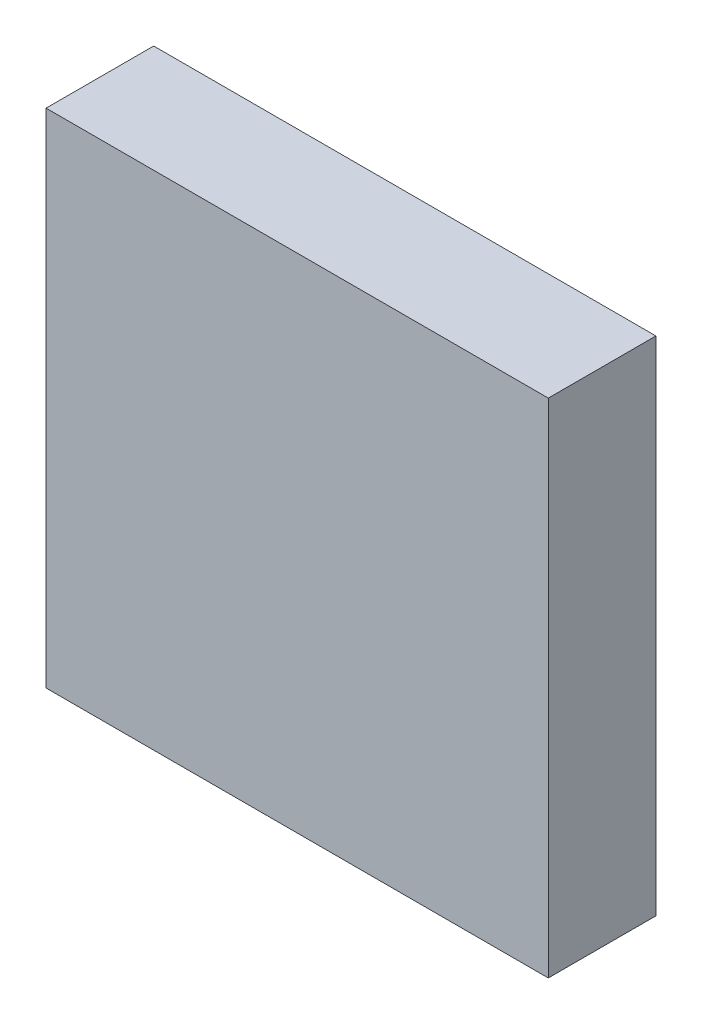
ISO-10303-21;
HEADER;
FILE_DESCRIPTION(('STEP AP214'),'2;1');
FILE_NAME('part.step','',(''),(''),'','','');
FILE_SCHEMA(('AUTOMOTIVE_DESIGN { 1 0 10303 214 1 1 1 1 }'));
ENDSEC;
DATA;
#1=APPLICATION_CONTEXT('core data for automotive mechanical design processes');
#2=APPLICATION_PROTOCOL_DEFINITION('international standard','automotive_design',2000,#1);
#3=PRODUCT_CONTEXT('',#1,'mechanical');
#4=PRODUCT('Part','Part','',(#3));
#5=PRODUCT_RELATED_PRODUCT_CATEGORY('part','',(#4));
#6=PRODUCT_DEFINITION_FORMATION('','',#4);
#7=PRODUCT_DEFINITION_CONTEXT('part definition',#1,'design');
#8=PRODUCT_DEFINITION('design','',#6,#7);
#9=PRODUCT_DEFINITION_SHAPE('','',#8);
#10=(LENGTH_UNIT() NAMED_UNIT(*) SI_UNIT(.MILLI.,.METRE.));
#11=(NAMED_UNIT(*) PLANE_ANGLE_UNIT() SI_UNIT($,.RADIAN.));
#12=(NAMED_UNIT(*) SI_UNIT($,.STERADIAN.) SOLID_ANGLE_UNIT());
#13=UNCERTAINTY_MEASURE_WITH_UNIT(LENGTH_MEASURE(1.E-05),#10,'distance_accuracy_value','');
#14=(GEOMETRIC_REPRESENTATION_CONTEXT(3) GLOBAL_UNCERTAINTY_ASSIGNED_CONTEXT((#13)) GLOBAL_UNIT_ASSIGNED_CONTEXT((#10,
#11,#12)) REPRESENTATION_CONTEXT('',''));
#15=CARTESIAN_POINT('',(0.,0.,0.));
#16=DIRECTION('',(0.,0.,1.));
#17=DIRECTION('',(1.,0.,0.));
#18=AXIS2_PLACEMENT_3D('',#15,#16,#17);
#19=CARTESIAN_POINT('',(7.,7.,3.));
#20=DIRECTION('',(-1.,0.,0.));
#21=DIRECTION('',(0.,-1.,0.));
#22=AXIS2_PLACEMENT_3D('',#19,#20,#21);
#23=PLANE('',#22);
#24=DIRECTION('',(0.,1.,0.));
#25=VECTOR('',#24,1.);
#26=CARTESIAN_POINT('',(7.,7.,0.));
#27=LINE('',#26,#25);
#28=CARTESIAN_POINT('',(7.,-7.,0.));
#29=VERTEX_POINT('',#28);
#30=CARTESIAN_POINT('',(7.,7.,0.));
#31=VERTEX_POINT('',#30);
#32=EDGE_CURVE('E96',#29,#31,#27,.T.);
#33=ORIENTED_EDGE('',*,*,#32,.T.);
#34=DIRECTION('',(0.,0.,-1.));
#35=VECTOR('',#34,1.);
#36=CARTESIAN_POINT('',(7.,7.,3.));
#37=LINE('',#36,#35);
#38=CARTESIAN_POINT('',(7.,7.,3.));
#39=VERTEX_POINT('',#38);
#40=EDGE_CURVE('E11',#39,#31,#37,.T.);
#41=ORIENTED_EDGE('',*,*,#40,.F.);
#42=DIRECTION('',(0.,1.,0.));
#43=VECTOR('',#42,1.);
#44=CARTESIAN_POINT('',(7.,7.,3.));
#45=LINE('',#44,#43);
#46=CARTESIAN_POINT('',(7.,-7.,3.));
#47=VERTEX_POINT('',#46);
#48=EDGE_CURVE('E84',#47,#39,#45,.T.);
#49=ORIENTED_EDGE('',*,*,#48,.F.);
#50=DIRECTION('',(0.,0.,-1.));
#51=VECTOR('',#50,1.);
#52=CARTESIAN_POINT('',(7.,-7.,3.));
#53=LINE('',#52,#51);
#54=EDGE_CURVE('E92',#47,#29,#53,.T.);
#55=ORIENTED_EDGE('',*,*,#54,.T.);
#56=EDGE_LOOP('',(#33,#41,#49,#55));
#57=FACE_BOUND('',#56,.T.);
#58=ADVANCED_FACE('F33',(#57),#23,.F.);
#59=CARTESIAN_POINT('',(-7.,7.,3.));
#60=DIRECTION('',(0.,-1.,0.));
#61=DIRECTION('',(0.,0.,-1.));
#62=AXIS2_PLACEMENT_3D('',#59,#60,#61);
#63=PLANE('',#62);
#64=DIRECTION('',(-1.,0.,0.));
#65=VECTOR('',#64,1.);
#66=CARTESIAN_POINT('',(-7.,7.,0.));
#67=LINE('',#66,#65);
#68=CARTESIAN_POINT('',(-7.,7.,0.));
#69=VERTEX_POINT('',#68);
#70=EDGE_CURVE('E88',#31,#69,#67,.T.);
#71=ORIENTED_EDGE('',*,*,#70,.T.);
#72=DIRECTION('',(0.,0.,-1.));
#73=VECTOR('',#72,1.);
#74=CARTESIAN_POINT('',(-7.,7.,3.));
#75=LINE('',#74,#73);
#76=CARTESIAN_POINT('',(-7.,7.,3.));
#77=VERTEX_POINT('',#76);
#78=EDGE_CURVE('E41',#77,#69,#75,.T.);
#79=ORIENTED_EDGE('',*,*,#78,.F.);
#80=DIRECTION('',(-1.,0.,0.));
#81=VECTOR('',#80,1.);
#82=CARTESIAN_POINT('',(-7.,7.,3.));
#83=LINE('',#82,#81);
#84=EDGE_CURVE('E79',#39,#77,#83,.T.);
#85=ORIENTED_EDGE('',*,*,#84,.F.);
#86=ORIENTED_EDGE('',*,*,#40,.T.);
#87=EDGE_LOOP('',(#71,#79,#85,#86));
#88=FACE_BOUND('',#87,.T.);
#89=ADVANCED_FACE('F87',(#88),#63,.F.);
#90=CARTESIAN_POINT('',(-7.,7.,3.));
#91=DIRECTION('',(1.,0.,0.));
#92=DIRECTION('',(0.,1.,0.));
#93=AXIS2_PLACEMENT_3D('',#90,#91,#92);
#94=PLANE('',#93);
#95=DIRECTION('',(0.,-1.,0.));
#96=VECTOR('',#95,1.);
#97=CARTESIAN_POINT('',(-7.,7.,0.));
#98=LINE('',#97,#96);
#99=CARTESIAN_POINT('',(-7.,-7.,0.));
#100=VERTEX_POINT('',#99);
#101=EDGE_CURVE('E66',#69,#100,#98,.T.);
#102=ORIENTED_EDGE('',*,*,#101,.T.);
#103=DIRECTION('',(0.,0.,-1.));
#104=VECTOR('',#103,1.);
#105=CARTESIAN_POINT('',(-7.,-7.,3.));
#106=LINE('',#105,#104);
#107=CARTESIAN_POINT('',(-7.,-7.,3.));
#108=VERTEX_POINT('',#107);
#109=EDGE_CURVE('E89',#108,#100,#106,.T.);
#110=ORIENTED_EDGE('',*,*,#109,.F.);
#111=DIRECTION('',(0.,-1.,0.));
#112=VECTOR('',#111,1.);
#113=CARTESIAN_POINT('',(-7.,7.,3.));
#114=LINE('',#113,#112);
#115=EDGE_CURVE('E82',#77,#108,#114,.T.);
#116=ORIENTED_EDGE('',*,*,#115,.F.);
#117=ORIENTED_EDGE('',*,*,#78,.T.);
#118=EDGE_LOOP('',(#102,#110,#116,#117));
#119=FACE_BOUND('',#118,.T.);
#120=ADVANCED_FACE('F90',(#119),#94,.F.);
#121=CARTESIAN_POINT('',(-7.,-7.,3.));
#122=DIRECTION('',(0.,1.,0.));
#123=DIRECTION('',(0.,0.,1.));
#124=AXIS2_PLACEMENT_3D('',#121,#122,#123);
#125=PLANE('',#124);
#126=DIRECTION('',(1.,0.,0.));
#127=VECTOR('',#126,1.);
#128=CARTESIAN_POINT('',(-7.,-7.,0.));
#129=LINE('',#128,#127);
#130=EDGE_CURVE('E72',#100,#29,#129,.T.);
#131=ORIENTED_EDGE('',*,*,#130,.T.);
#132=ORIENTED_EDGE('',*,*,#54,.F.);
#133=DIRECTION('',(1.,0.,0.));
#134=VECTOR('',#133,1.);
#135=CARTESIAN_POINT('',(-7.,-7.,3.));
#136=LINE('',#135,#134);
#137=EDGE_CURVE('E49',#108,#47,#136,.T.);
#138=ORIENTED_EDGE('',*,*,#137,.F.);
#139=ORIENTED_EDGE('',*,*,#109,.T.);
#140=EDGE_LOOP('',(#131,#132,#138,#139));
#141=FACE_BOUND('',#140,.T.);
#142=ADVANCED_FACE('F103',(#141),#125,.F.);
#143=CARTESIAN_POINT('',(0.,0.,3.));
#144=DIRECTION('',(0.,0.,1.));
#145=DIRECTION('',(1.,0.,0.));
#146=AXIS2_PLACEMENT_3D('',#143,#144,#145);
#147=PLANE('',#146);
#148=ORIENTED_EDGE('',*,*,#48,.T.);
#149=ORIENTED_EDGE('',*,*,#84,.T.);
#150=ORIENTED_EDGE('',*,*,#115,.T.);
#151=ORIENTED_EDGE('',*,*,#137,.T.);
#152=EDGE_LOOP('',(#148,#149,#150,#151));
#153=FACE_BOUND('',#152,.T.);
#154=ADVANCED_FACE('F80',(#153),#147,.T.);
#155=CARTESIAN_POINT('',(0.,0.,0.));
#156=DIRECTION('',(0.,0.,1.));
#157=DIRECTION('',(1.,0.,0.));
#158=AXIS2_PLACEMENT_3D('',#155,#156,#157);
#159=PLANE('',#158);
#160=ORIENTED_EDGE('',*,*,#32,.F.);
#161=ORIENTED_EDGE('',*,*,#130,.F.);
#162=ORIENTED_EDGE('',*,*,#101,.F.);
#163=ORIENTED_EDGE('',*,*,#70,.F.);
#164=EDGE_LOOP('',(#160,#161,#162,#163));
#165=FACE_BOUND('',#164,.T.);
#166=ADVANCED_FACE('F106',(#165),#159,.F.);
#167=CLOSED_SHELL('',(#58,#89,#120,#142,#154,#166));
#168=MANIFOLD_SOLID_BREP('B2',#167);
#169=ADVANCED_BREP_SHAPE_REPRESENTATION('',(#18,#168),#14);
#170=SHAPE_DEFINITION_REPRESENTATION(#9,#169);
ENDSEC;
END-ISO-10303-21;
